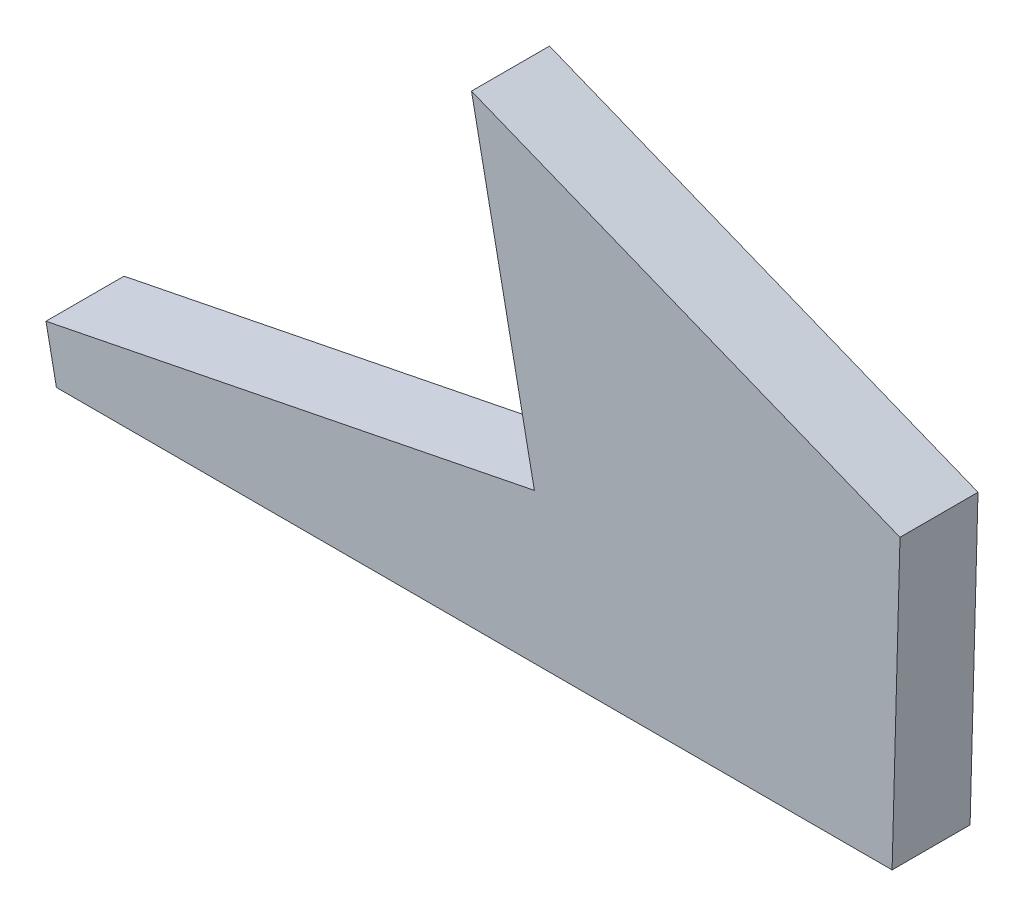
ISO-10303-21;
HEADER;
FILE_DESCRIPTION(('STEP AP214'),'2;1');
FILE_NAME('part.step','',(''),(''),'','','');
FILE_SCHEMA(('AUTOMOTIVE_DESIGN { 1 0 10303 214 1 1 1 1 }'));
ENDSEC;
DATA;
#1=APPLICATION_CONTEXT('core data for automotive mechanical design processes');
#2=APPLICATION_PROTOCOL_DEFINITION('international standard','automotive_design',2000,#1);
#3=PRODUCT_CONTEXT('',#1,'mechanical');
#4=PRODUCT('Part','Part','',(#3));
#5=PRODUCT_RELATED_PRODUCT_CATEGORY('part','',(#4));
#6=PRODUCT_DEFINITION_FORMATION('','',#4);
#7=PRODUCT_DEFINITION_CONTEXT('part definition',#1,'design');
#8=PRODUCT_DEFINITION('design','',#6,#7);
#9=PRODUCT_DEFINITION_SHAPE('','',#8);
#10=(LENGTH_UNIT() NAMED_UNIT(*) SI_UNIT(.MILLI.,.METRE.));
#11=(NAMED_UNIT(*) PLANE_ANGLE_UNIT() SI_UNIT($,.RADIAN.));
#12=(NAMED_UNIT(*) SI_UNIT($,.STERADIAN.) SOLID_ANGLE_UNIT());
#13=UNCERTAINTY_MEASURE_WITH_UNIT(LENGTH_MEASURE(1.E-05),#10,'distance_accuracy_value','');
#14=(GEOMETRIC_REPRESENTATION_CONTEXT(3) GLOBAL_UNCERTAINTY_ASSIGNED_CONTEXT((#13)) GLOBAL_UNIT_ASSIGNED_CONTEXT((#10,
#11,#12)) REPRESENTATION_CONTEXT('',''));
#15=CARTESIAN_POINT('',(0.,0.,0.));
#16=DIRECTION('',(0.,0.,1.));
#17=DIRECTION('',(1.,0.,0.));
#18=AXIS2_PLACEMENT_3D('',#15,#16,#17);
#19=CARTESIAN_POINT('',(-0.07136553153558,-0.424437108606,0.3));
#20=DIRECTION('',(0.,-1.,0.));
#21=DIRECTION('',(1.,0.,0.));
#22=AXIS2_PLACEMENT_3D('',#19,#20,#21);
#23=PLANE('',#22);
#24=DIRECTION('',(1.,0.,0.));
#25=VECTOR('',#24,1.);
#26=CARTESIAN_POINT('',(-0.07136553153558,-0.424437108606,0.3));
#27=LINE('',#26,#25);
#28=CARTESIAN_POINT('',(-0.07136553153558,-0.424437108606,0.3));
#29=VERTEX_POINT('',#28);
#30=CARTESIAN_POINT('',(0.999999977648,-0.424437108606,0.3));
#31=VERTEX_POINT('',#30);
#32=EDGE_CURVE('E11',#29,#31,#27,.T.);
#33=ORIENTED_EDGE('',*,*,#32,.T.);
#34=DIRECTION('',(0.,0.,1.));
#35=VECTOR('',#34,1.);
#36=CARTESIAN_POINT('',(0.999999977648,-0.424437108606,0.3));
#37=LINE('',#36,#35);
#38=CARTESIAN_POINT('',(0.999999977648,-0.424437108606,0.4));
#39=VERTEX_POINT('',#38);
#40=EDGE_CURVE('E27',#31,#39,#37,.T.);
#41=ORIENTED_EDGE('',*,*,#40,.T.);
#42=DIRECTION('',(1.,0.,0.));
#43=VECTOR('',#42,1.);
#44=CARTESIAN_POINT('',(-0.07136553153558,-0.424437108606,0.4));
#45=LINE('',#44,#43);
#46=CARTESIAN_POINT('',(-0.07136553153558,-0.424437108606,0.4));
#47=VERTEX_POINT('',#46);
#48=EDGE_CURVE('E85',#47,#39,#45,.T.);
#49=ORIENTED_EDGE('',*,*,#48,.F.);
#50=DIRECTION('',(0.,0.,1.));
#51=VECTOR('',#50,1.);
#52=CARTESIAN_POINT('',(-0.07136553153558,-0.424437108606,0.3));
#53=LINE('',#52,#51);
#54=EDGE_CURVE('E96',#29,#47,#53,.T.);
#55=ORIENTED_EDGE('',*,*,#54,.F.);
#56=EDGE_LOOP('',(#33,#41,#49,#55));
#57=FACE_BOUND('',#56,.T.);
#58=ADVANCED_FACE('F17',(#57),#23,.T.);
#59=CARTESIAN_POINT('',(-0.0847465686985,-0.357531922792,0.3));
#60=DIRECTION('',(-0.980580675690959,-0.196116135137992,0.));
#61=DIRECTION('',(0.196116135137992,-0.980580675690959,0.));
#62=AXIS2_PLACEMENT_3D('',#59,#60,#61);
#63=PLANE('',#62);
#64=DIRECTION('',(0.196116135137992,-0.980580675690959,0.));
#65=VECTOR('',#64,1.);
#66=CARTESIAN_POINT('',(-0.0847465686985,-0.357531922792,0.3));
#67=LINE('',#66,#65);
#68=CARTESIAN_POINT('',(-0.0847465686985,-0.357531922792,0.3));
#69=VERTEX_POINT('',#68);
#70=EDGE_CURVE('E93',#69,#29,#67,.T.);
#71=ORIENTED_EDGE('',*,*,#70,.T.);
#72=ORIENTED_EDGE('',*,*,#54,.T.);
#73=DIRECTION('',(0.196116135137992,-0.980580675690959,0.));
#74=VECTOR('',#73,1.);
#75=CARTESIAN_POINT('',(-0.0847465686985,-0.357531922792,0.4));
#76=LINE('',#75,#74);
#77=CARTESIAN_POINT('',(-0.0847465686985,-0.357531922792,0.4));
#78=VERTEX_POINT('',#77);
#79=EDGE_CURVE('E87',#78,#47,#76,.T.);
#80=ORIENTED_EDGE('',*,*,#79,.F.);
#81=DIRECTION('',(0.,0.,1.));
#82=VECTOR('',#81,1.);
#83=CARTESIAN_POINT('',(-0.0847465686985,-0.357531922792,0.3));
#84=LINE('',#83,#82);
#85=EDGE_CURVE('E103',#69,#78,#84,.T.);
#86=ORIENTED_EDGE('',*,*,#85,.F.);
#87=EDGE_LOOP('',(#71,#72,#80,#86));
#88=FACE_BOUND('',#87,.T.);
#89=ADVANCED_FACE('F127',(#88),#63,.T.);
#90=CARTESIAN_POINT('',(0.541392362483,-0.232304136555,0.3));
#91=DIRECTION('',(-0.196116135137992,0.980580675690959,0.));
#92=DIRECTION('',(-0.980580675690959,-0.196116135137992,0.));
#93=AXIS2_PLACEMENT_3D('',#90,#91,#92);
#94=PLANE('',#93);
#95=DIRECTION('',(-0.980580675690959,-0.196116135137992,0.));
#96=VECTOR('',#95,1.);
#97=CARTESIAN_POINT('',(0.541392362483,-0.232304136555,0.3));
#98=LINE('',#97,#96);
#99=CARTESIAN_POINT('',(0.541392362483,-0.232304136555,0.3));
#100=VERTEX_POINT('',#99);
#101=EDGE_CURVE('E99',#100,#69,#98,.T.);
#102=ORIENTED_EDGE('',*,*,#101,.T.);
#103=ORIENTED_EDGE('',*,*,#85,.T.);
#104=DIRECTION('',(-0.980580675690959,-0.196116135137992,0.));
#105=VECTOR('',#104,1.);
#106=CARTESIAN_POINT('',(0.541392362483,-0.232304136555,0.4));
#107=LINE('',#106,#105);
#108=CARTESIAN_POINT('',(0.541392362483,-0.232304136555,0.4));
#109=VERTEX_POINT('',#108);
#110=EDGE_CURVE('E102',#109,#78,#107,.T.);
#111=ORIENTED_EDGE('',*,*,#110,.F.);
#112=DIRECTION('',(0.,0.,1.));
#113=VECTOR('',#112,1.);
#114=CARTESIAN_POINT('',(0.541392362483,-0.232304136555,0.3));
#115=LINE('',#114,#113);
#116=EDGE_CURVE('E110',#100,#109,#115,.T.);
#117=ORIENTED_EDGE('',*,*,#116,.F.);
#118=EDGE_LOOP('',(#102,#103,#111,#117));
#119=FACE_BOUND('',#118,.T.);
#120=ADVANCED_FACE('F125',(#119),#94,.T.);
#121=CARTESIAN_POINT('',(0.460784564555,0.170734853087,0.3));
#122=DIRECTION('',(-0.980580675690959,-0.196116135137992,0.));
#123=DIRECTION('',(0.196116135137992,-0.980580675690959,0.));
#124=AXIS2_PLACEMENT_3D('',#121,#122,#123);
#125=PLANE('',#124);
#126=DIRECTION('',(0.196116135137992,-0.980580675690959,0.));
#127=VECTOR('',#126,1.);
#128=CARTESIAN_POINT('',(0.460784564555,0.170734853087,0.3));
#129=LINE('',#128,#127);
#130=CARTESIAN_POINT('',(0.460784564555,0.170734853087,0.3));
#131=VERTEX_POINT('',#130);
#132=EDGE_CURVE('E106',#131,#100,#129,.T.);
#133=ORIENTED_EDGE('',*,*,#132,.T.);
#134=ORIENTED_EDGE('',*,*,#116,.T.);
#135=DIRECTION('',(0.196116135137992,-0.980580675690959,0.));
#136=VECTOR('',#135,1.);
#137=CARTESIAN_POINT('',(0.460784564555,0.170734853087,0.4));
#138=LINE('',#137,#136);
#139=CARTESIAN_POINT('',(0.460784564555,0.170734853087,0.4));
#140=VERTEX_POINT('',#139);
#141=EDGE_CURVE('E77',#140,#109,#138,.T.);
#142=ORIENTED_EDGE('',*,*,#141,.F.);
#143=DIRECTION('',(0.,0.,1.));
#144=VECTOR('',#143,1.);
#145=CARTESIAN_POINT('',(0.460784564555,0.170734853087,0.3));
#146=LINE('',#145,#144);
#147=EDGE_CURVE('E73',#131,#140,#146,.T.);
#148=ORIENTED_EDGE('',*,*,#147,.F.);
#149=EDGE_LOOP('',(#133,#134,#142,#148));
#150=FACE_BOUND('',#149,.T.);
#151=ADVANCED_FACE('F123',(#150),#125,.T.);
#152=CARTESIAN_POINT('',(1.010150928282,-0.04999999888241,0.3));
#153=DIRECTION('',(0.37282926987699,0.927899959867975,0.));
#154=DIRECTION('',(-0.927899959867975,0.37282926987699,0.));
#155=AXIS2_PLACEMENT_3D('',#152,#153,#154);
#156=PLANE('',#155);
#157=DIRECTION('',(-0.927899959867975,0.37282926987699,0.));
#158=VECTOR('',#157,1.);
#159=CARTESIAN_POINT('',(1.010150928282,-0.04999999888241,0.3));
#160=LINE('',#159,#158);
#161=CARTESIAN_POINT('',(1.010150928282,-0.04999999888241,0.3));
#162=VERTEX_POINT('',#161);
#163=EDGE_CURVE('E113',#162,#131,#160,.T.);
#164=ORIENTED_EDGE('',*,*,#163,.T.);
#165=ORIENTED_EDGE('',*,*,#147,.T.);
#166=DIRECTION('',(-0.927899959867975,0.37282926987699,0.));
#167=VECTOR('',#166,1.);
#168=CARTESIAN_POINT('',(1.010150928282,-0.04999999888241,0.4));
#169=LINE('',#168,#167);
#170=CARTESIAN_POINT('',(1.010150928282,-0.04999999888241,0.4));
#171=VERTEX_POINT('',#170);
#172=EDGE_CURVE('E71',#171,#140,#169,.T.);
#173=ORIENTED_EDGE('',*,*,#172,.F.);
#174=DIRECTION('',(0.,0.,1.));
#175=VECTOR('',#174,1.);
#176=CARTESIAN_POINT('',(1.010150928282,-0.04999999888241,0.3));
#177=LINE('',#176,#175);
#178=EDGE_CURVE('E67',#162,#171,#177,.T.);
#179=ORIENTED_EDGE('',*,*,#178,.F.);
#180=EDGE_LOOP('',(#164,#165,#173,#179));
#181=FACE_BOUND('',#180,.T.);
#182=ADVANCED_FACE('F72',(#181),#156,.T.);
#183=CARTESIAN_POINT('',(0.999999977648,-0.424437108606,0.3));
#184=DIRECTION('',(0.999632729234303,-0.0270999380733182,0.));
#185=DIRECTION('',(0.0270999380733182,0.999632729234303,0.));
#186=AXIS2_PLACEMENT_3D('',#183,#184,#185);
#187=PLANE('',#186);
#188=DIRECTION('',(0.0270999380733182,0.999632729234303,0.));
#189=VECTOR('',#188,1.);
#190=CARTESIAN_POINT('',(0.999999977648,-0.424437108606,0.3));
#191=LINE('',#190,#189);
#192=EDGE_CURVE('E81',#31,#162,#191,.T.);
#193=ORIENTED_EDGE('',*,*,#192,.T.);
#194=ORIENTED_EDGE('',*,*,#178,.T.);
#195=DIRECTION('',(0.0270999380733182,0.999632729234303,0.));
#196=VECTOR('',#195,1.);
#197=CARTESIAN_POINT('',(0.999999977648,-0.424437108606,0.4));
#198=LINE('',#197,#196);
#199=EDGE_CURVE('E21',#39,#171,#198,.T.);
#200=ORIENTED_EDGE('',*,*,#199,.F.);
#201=ORIENTED_EDGE('',*,*,#40,.F.);
#202=EDGE_LOOP('',(#193,#194,#200,#201));
#203=FACE_BOUND('',#202,.T.);
#204=ADVANCED_FACE('F79',(#203),#187,.T.);
#205=CARTESIAN_POINT('',(0.462702179792,-0.12685112776,0.4));
#206=DIRECTION('',(0.,0.,1.));
#207=DIRECTION('',(1.,0.,0.));
#208=AXIS2_PLACEMENT_3D('',#205,#206,#207);
#209=PLANE('',#208);
#210=ORIENTED_EDGE('',*,*,#199,.T.);
#211=ORIENTED_EDGE('',*,*,#172,.T.);
#212=ORIENTED_EDGE('',*,*,#141,.T.);
#213=ORIENTED_EDGE('',*,*,#110,.T.);
#214=ORIENTED_EDGE('',*,*,#79,.T.);
#215=ORIENTED_EDGE('',*,*,#48,.T.);
#216=EDGE_LOOP('',(#210,#211,#212,#213,#214,#215));
#217=FACE_BOUND('',#216,.T.);
#218=ADVANCED_FACE('F83',(#217),#209,.T.);
#219=CARTESIAN_POINT('',(0.462702179792,-0.12685112776,0.3));
#220=DIRECTION('',(0.,0.,1.));
#221=DIRECTION('',(1.,0.,0.));
#222=AXIS2_PLACEMENT_3D('',#219,#220,#221);
#223=PLANE('',#222);
#224=ORIENTED_EDGE('',*,*,#192,.F.);
#225=ORIENTED_EDGE('',*,*,#32,.F.);
#226=ORIENTED_EDGE('',*,*,#70,.F.);
#227=ORIENTED_EDGE('',*,*,#101,.F.);
#228=ORIENTED_EDGE('',*,*,#132,.F.);
#229=ORIENTED_EDGE('',*,*,#163,.F.);
#230=EDGE_LOOP('',(#224,#225,#226,#227,#228,#229));
#231=FACE_BOUND('',#230,.T.);
#232=ADVANCED_FACE('F19',(#231),#223,.F.);
#233=CLOSED_SHELL('',(#58,#89,#120,#151,#182,#204,#218,#232));
#234=MANIFOLD_SOLID_BREP('B1',#233);
#235=ADVANCED_BREP_SHAPE_REPRESENTATION('',(#18,#234),#14);
#236=SHAPE_DEFINITION_REPRESENTATION(#9,#235);
ENDSEC;
END-ISO-10303-21;
